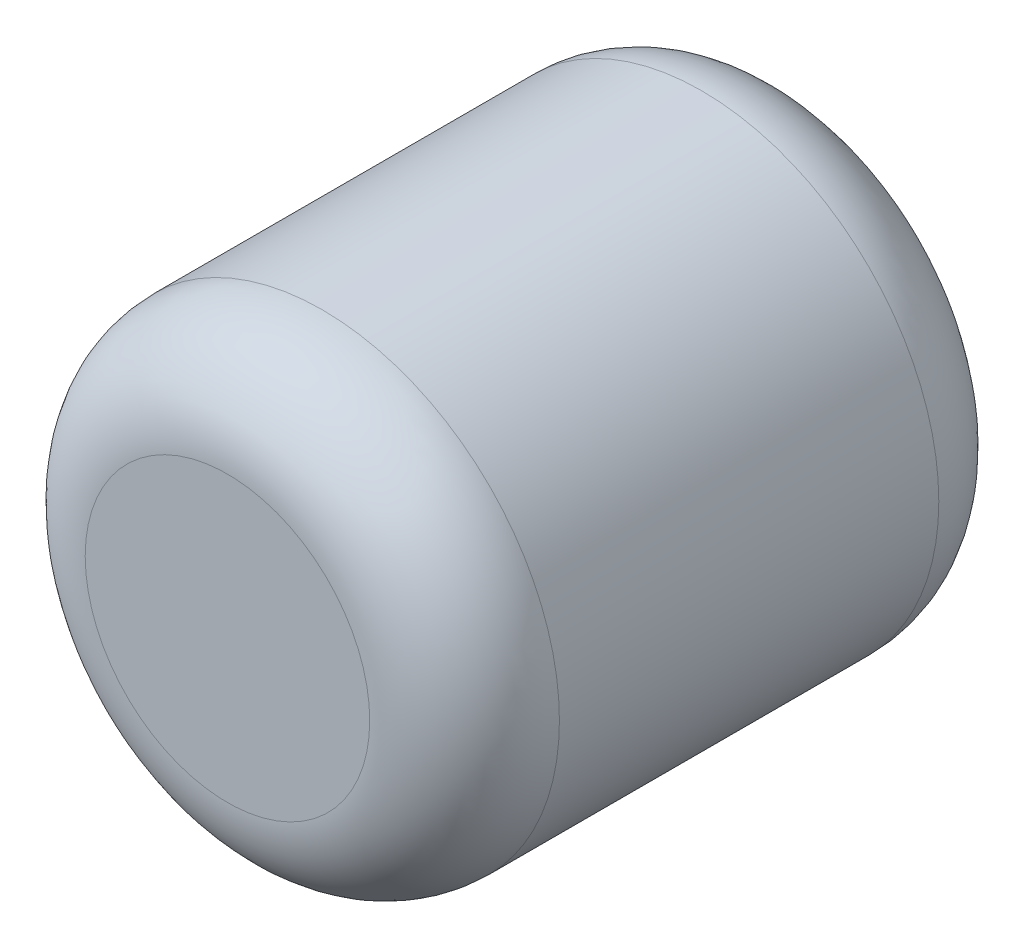
ISO-10303-21;
HEADER;
FILE_DESCRIPTION(('STEP AP214'),'2;1');
FILE_NAME('part.step','',(''),(''),'','','');
FILE_SCHEMA(('AUTOMOTIVE_DESIGN { 1 0 10303 214 1 1 1 1 }'));
ENDSEC;
DATA;
#1=APPLICATION_CONTEXT('core data for automotive mechanical design processes');
#2=APPLICATION_PROTOCOL_DEFINITION('international standard','automotive_design',2000,#1);
#3=PRODUCT_CONTEXT('',#1,'mechanical');
#4=PRODUCT('Part','Part','',(#3));
#5=PRODUCT_RELATED_PRODUCT_CATEGORY('part','',(#4));
#6=PRODUCT_DEFINITION_FORMATION('','',#4);
#7=PRODUCT_DEFINITION_CONTEXT('part definition',#1,'design');
#8=PRODUCT_DEFINITION('design','',#6,#7);
#9=PRODUCT_DEFINITION_SHAPE('','',#8);
#10=(LENGTH_UNIT() NAMED_UNIT(*) SI_UNIT(.MILLI.,.METRE.));
#11=(NAMED_UNIT(*) PLANE_ANGLE_UNIT() SI_UNIT($,.RADIAN.));
#12=(NAMED_UNIT(*) SI_UNIT($,.STERADIAN.) SOLID_ANGLE_UNIT());
#13=UNCERTAINTY_MEASURE_WITH_UNIT(LENGTH_MEASURE(1.E-05),#10,'distance_accuracy_value','');
#14=(GEOMETRIC_REPRESENTATION_CONTEXT(3) GLOBAL_UNCERTAINTY_ASSIGNED_CONTEXT((#13)) GLOBAL_UNIT_ASSIGNED_CONTEXT((#10,
#11,#12)) REPRESENTATION_CONTEXT('',''));
#15=CARTESIAN_POINT('',(0.,0.,0.));
#16=DIRECTION('',(0.,0.,1.));
#17=DIRECTION('',(1.,0.,0.));
#18=AXIS2_PLACEMENT_3D('',#15,#16,#17);
#19=CARTESIAN_POINT('',(0.,0.,152.4));
#20=DIRECTION('',(0.,0.,-1.));
#21=DIRECTION('',(-1.,0.,0.));
#22=AXIS2_PLACEMENT_3D('',#19,#20,#21);
#23=CYLINDRICAL_SURFACE('',#22,63.5);
#24=CARTESIAN_POINT('',(0.,0.,25.4));
#25=DIRECTION('',(0.,0.,1.));
#26=DIRECTION('',(1.,0.,0.));
#27=AXIS2_PLACEMENT_3D('',#24,#25,#26);
#28=CIRCLE('',#27,63.5);
#29=CARTESIAN_POINT('',(-63.5,0.,25.4));
#30=VERTEX_POINT('',#29);
#31=EDGE_CURVE('E42',#30,#30,#28,.T.);
#32=CARTESIAN_POINT('',(0.,0.,127.));
#33=DIRECTION('',(0.,0.,1.));
#34=DIRECTION('',(1.,0.,0.));
#35=AXIS2_PLACEMENT_3D('',#32,#33,#34);
#36=CIRCLE('',#35,63.5);
#37=CARTESIAN_POINT('',(-63.5,0.,127.));
#38=VERTEX_POINT('',#37);
#39=EDGE_CURVE('E46',#38,#38,#36,.F.);
#40=CARTESIAN_POINT('',(-63.5,0.,25.4));
#41=CARTESIAN_POINT('',(-63.5,0.,26.4583333333333));
#42=CARTESIAN_POINT('',(-63.5,0.,27.5166666666666));
#43=CARTESIAN_POINT('',(-63.5,0.,29.6333333333333));
#44=CARTESIAN_POINT('',(-63.5,0.,30.6916666666666));
#45=CARTESIAN_POINT('',(-63.5,0.,32.8083333333333));
#46=CARTESIAN_POINT('',(-63.5,0.,33.8666666666666));
#47=CARTESIAN_POINT('',(-63.5,0.,35.9833333333333));
#48=CARTESIAN_POINT('',(-63.5,0.,37.0416666666666));
#49=CARTESIAN_POINT('',(-63.5,0.,39.1583333333333));
#50=CARTESIAN_POINT('',(-63.5,0.,40.2166666666666));
#51=CARTESIAN_POINT('',(-63.5,0.,42.3333333333333));
#52=CARTESIAN_POINT('',(-63.5,0.,43.3916666666666));
#53=CARTESIAN_POINT('',(-63.5,0.,45.5083333333333));
#54=CARTESIAN_POINT('',(-63.5,0.,46.5666666666666));
#55=CARTESIAN_POINT('',(-63.5,0.,48.6833333333333));
#56=CARTESIAN_POINT('',(-63.5,0.,49.7416666666666));
#57=CARTESIAN_POINT('',(-63.5,0.,51.8583333333333));
#58=CARTESIAN_POINT('',(-63.5,0.,52.9166666666666));
#59=CARTESIAN_POINT('',(-63.5,0.,55.0333333333333));
#60=CARTESIAN_POINT('',(-63.5,0.,56.0916666666666));
#61=CARTESIAN_POINT('',(-63.5,0.,58.2083333333333));
#62=CARTESIAN_POINT('',(-63.5,0.,59.2666666666666));
#63=CARTESIAN_POINT('',(-63.5,0.,61.3833333333333));
#64=CARTESIAN_POINT('',(-63.5,0.,62.4416666666666));
#65=CARTESIAN_POINT('',(-63.5,0.,64.5583333333333));
#66=CARTESIAN_POINT('',(-63.5,0.,65.6166666666666));
#67=CARTESIAN_POINT('',(-63.5,0.,67.7333333333333));
#68=CARTESIAN_POINT('',(-63.5,0.,68.7916666666666));
#69=CARTESIAN_POINT('',(-63.5,0.,70.9083333333333));
#70=CARTESIAN_POINT('',(-63.5,0.,71.9666666666667));
#71=CARTESIAN_POINT('',(-63.5,0.,74.0833333333333));
#72=CARTESIAN_POINT('',(-63.5,0.,75.1416666666667));
#73=CARTESIAN_POINT('',(-63.5,0.,77.2583333333333));
#74=CARTESIAN_POINT('',(-63.5,0.,78.3166666666666));
#75=CARTESIAN_POINT('',(-63.5,0.,80.4333333333333));
#76=CARTESIAN_POINT('',(-63.5,0.,81.4916666666666));
#77=CARTESIAN_POINT('',(-63.5,0.,83.6083333333333));
#78=CARTESIAN_POINT('',(-63.5,0.,84.6666666666666));
#79=CARTESIAN_POINT('',(-63.5,0.,86.7833333333333));
#80=CARTESIAN_POINT('',(-63.5,0.,87.8416666666667));
#81=CARTESIAN_POINT('',(-63.5,0.,89.9583333333333));
#82=CARTESIAN_POINT('',(-63.5,0.,91.0166666666666));
#83=CARTESIAN_POINT('',(-63.5,0.,93.1333333333333));
#84=CARTESIAN_POINT('',(-63.5,0.,94.1916666666666));
#85=CARTESIAN_POINT('',(-63.5,0.,96.3083333333333));
#86=CARTESIAN_POINT('',(-63.5,0.,97.3666666666666));
#87=CARTESIAN_POINT('',(-63.5,0.,99.4833333333333));
#88=CARTESIAN_POINT('',(-63.5,0.,100.541666666667));
#89=CARTESIAN_POINT('',(-63.5,0.,102.658333333333));
#90=CARTESIAN_POINT('',(-63.5,0.,103.716666666667));
#91=CARTESIAN_POINT('',(-63.5,0.,105.833333333333));
#92=CARTESIAN_POINT('',(-63.5,0.,106.891666666667));
#93=CARTESIAN_POINT('',(-63.5,0.,109.008333333333));
#94=CARTESIAN_POINT('',(-63.5,0.,110.066666666667));
#95=CARTESIAN_POINT('',(-63.5,0.,112.183333333333));
#96=CARTESIAN_POINT('',(-63.5,0.,113.241666666667));
#97=CARTESIAN_POINT('',(-63.5,0.,115.358333333333));
#98=CARTESIAN_POINT('',(-63.5,0.,116.416666666667));
#99=CARTESIAN_POINT('',(-63.5,0.,118.533333333333));
#100=CARTESIAN_POINT('',(-63.5,0.,119.591666666667));
#101=CARTESIAN_POINT('',(-63.5,0.,121.708333333333));
#102=CARTESIAN_POINT('',(-63.5,0.,122.766666666667));
#103=CARTESIAN_POINT('',(-63.5,0.,124.883333333333));
#104=CARTESIAN_POINT('',(-63.5,0.,125.941666666667));
#105=CARTESIAN_POINT('',(-63.5,0.,127.));
#106=B_SPLINE_CURVE_WITH_KNOTS('',3,(#40,#41,#42,#43,#44,#45,#46,#47,#48,#49,#50,#51,#52,#53,
#54,#55,#56,#57,#58,#59,#60,#61,#62,#63,#64,#65,#66,#67,#68,#69,#70,#71,#72,#73,#74,#75,#76,#77,
#78,#79,#80,#81,#82,#83,#84,#85,#86,#87,#88,#89,#90,#91,#92,#93,#94,#95,#96,#97,#98,#99,#100,
#101,#102,#103,#104,#105),.UNSPECIFIED.,.F.,.F.,(4,2,2,2,2,2,2,2,2,2,2,2,2,2,2,2,2,2,2,2,2,2,2,
2,2,2,2,2,2,2,2,2,4),(0.,3.17499999999998,6.34999999999998,9.52499999999999,12.7,15.875,19.05,
22.225,25.4,28.575,31.75,34.925,38.1,41.275,44.45,47.625,50.8,53.975,57.15,60.325,63.5,66.675,
69.85,73.025,76.2,79.375,82.55,85.725,88.9,92.075,95.25,98.425,101.6),.UNSPECIFIED.);
#107=EDGE_CURVE('BSEAM31',#30,#38,#106,.T.);
#108=ORIENTED_EDGE('',*,*,#31,.T.);
#109=ORIENTED_EDGE('',*,*,#39,.T.);
#110=ORIENTED_EDGE('',*,*,#107,.T.);
#111=ORIENTED_EDGE('',*,*,#107,.F.);
#112=EDGE_LOOP('',(#108,#110,#109,#111));
#113=FACE_BOUND('',#112,.T.);
#114=ADVANCED_FACE('F31',(#113),#23,.T.);
#115=CARTESIAN_POINT('',(0.,0.,152.4));
#116=DIRECTION('',(0.,0.,1.));
#117=DIRECTION('',(1.,0.,0.));
#118=AXIS2_PLACEMENT_3D('',#115,#116,#117);
#119=PLANE('',#118);
#120=CARTESIAN_POINT('',(0.,0.,152.4));
#121=DIRECTION('',(0.,0.,1.));
#122=DIRECTION('',(1.,0.,0.));
#123=AXIS2_PLACEMENT_3D('',#120,#121,#122);
#124=CIRCLE('',#123,38.1);
#125=CARTESIAN_POINT('',(38.1,0.,152.4));
#126=VERTEX_POINT('',#125);
#127=EDGE_CURVE('E10',#126,#126,#124,.T.);
#128=ORIENTED_EDGE('',*,*,#127,.T.);
#129=EDGE_LOOP('',(#128));
#130=FACE_BOUND('',#129,.T.);
#131=ADVANCED_FACE('F62',(#130),#119,.T.);
#132=CARTESIAN_POINT('',(0.,0.,0.));
#133=DIRECTION('',(0.,0.,1.));
#134=DIRECTION('',(1.,0.,0.));
#135=AXIS2_PLACEMENT_3D('',#132,#133,#134);
#136=PLANE('',#135);
#137=CARTESIAN_POINT('',(0.,0.,0.));
#138=DIRECTION('',(0.,0.,1.));
#139=DIRECTION('',(1.,0.,0.));
#140=AXIS2_PLACEMENT_3D('',#137,#138,#139);
#141=CIRCLE('',#140,38.1);
#142=CARTESIAN_POINT('',(38.1,0.,0.));
#143=VERTEX_POINT('',#142);
#144=EDGE_CURVE('E38',#143,#143,#141,.F.);
#145=ORIENTED_EDGE('',*,*,#144,.T.);
#146=EDGE_LOOP('',(#145));
#147=FACE_BOUND('',#146,.T.);
#148=ADVANCED_FACE('F59',(#147),#136,.F.);
#149=CARTESIAN_POINT('',(0.,0.,25.4));
#150=DIRECTION('',(0.,0.,1.));
#151=DIRECTION('',(1.,0.,0.));
#152=AXIS2_PLACEMENT_3D('',#149,#150,#151);
#153=TOROIDAL_SURFACE('',#152,38.1,25.4);
#154=ORIENTED_EDGE('',*,*,#144,.F.);
#155=EDGE_LOOP('',(#154));
#156=FACE_BOUND('',#155,.T.);
#157=ORIENTED_EDGE('',*,*,#31,.F.);
#158=EDGE_LOOP('',(#157));
#159=FACE_BOUND('',#158,.T.);
#160=ADVANCED_FACE('F55',(#156,#159),#153,.T.);
#161=CARTESIAN_POINT('',(0.,0.,127.));
#162=DIRECTION('',(0.,0.,1.));
#163=DIRECTION('',(1.,0.,0.));
#164=AXIS2_PLACEMENT_3D('',#161,#162,#163);
#165=TOROIDAL_SURFACE('',#164,38.1,25.4);
#166=ORIENTED_EDGE('',*,*,#39,.F.);
#167=EDGE_LOOP('',(#166));
#168=FACE_BOUND('',#167,.T.);
#169=ORIENTED_EDGE('',*,*,#127,.F.);
#170=EDGE_LOOP('',(#169));
#171=FACE_BOUND('',#170,.T.);
#172=ADVANCED_FACE('F33',(#168,#171),#165,.T.);
#173=CLOSED_SHELL('',(#114,#131,#148,#160,#172));
#174=MANIFOLD_SOLID_BREP('B2',#173);
#175=ADVANCED_BREP_SHAPE_REPRESENTATION('',(#18,#174),#14);
#176=SHAPE_DEFINITION_REPRESENTATION(#9,#175);
ENDSEC;
END-ISO-10303-21;
